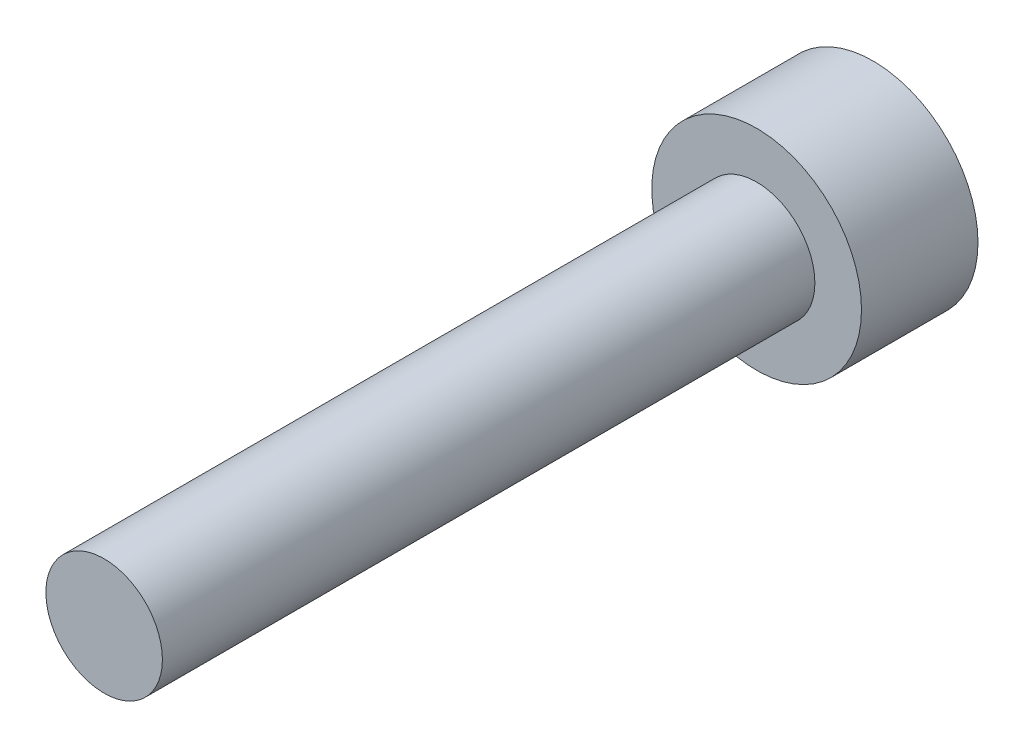
ISO-10303-21;
HEADER;
FILE_DESCRIPTION(('STEP AP214'),'2;1');
FILE_NAME('part.step','',(''),(''),'','','');
FILE_SCHEMA(('AUTOMOTIVE_DESIGN { 1 0 10303 214 1 1 1 1 }'));
ENDSEC;
DATA;
#1=APPLICATION_CONTEXT('core data for automotive mechanical design processes');
#2=APPLICATION_PROTOCOL_DEFINITION('international standard','automotive_design',2000,#1);
#3=PRODUCT_CONTEXT('',#1,'mechanical');
#4=PRODUCT('Part','Part','',(#3));
#5=PRODUCT_RELATED_PRODUCT_CATEGORY('part','',(#4));
#6=PRODUCT_DEFINITION_FORMATION('','',#4);
#7=PRODUCT_DEFINITION_CONTEXT('part definition',#1,'design');
#8=PRODUCT_DEFINITION('design','',#6,#7);
#9=PRODUCT_DEFINITION_SHAPE('','',#8);
#10=(LENGTH_UNIT() NAMED_UNIT(*) SI_UNIT(.MILLI.,.METRE.));
#11=(NAMED_UNIT(*) PLANE_ANGLE_UNIT() SI_UNIT($,.RADIAN.));
#12=(NAMED_UNIT(*) SI_UNIT($,.STERADIAN.) SOLID_ANGLE_UNIT());
#13=UNCERTAINTY_MEASURE_WITH_UNIT(LENGTH_MEASURE(1.E-05),#10,'distance_accuracy_value','');
#14=(GEOMETRIC_REPRESENTATION_CONTEXT(3) GLOBAL_UNCERTAINTY_ASSIGNED_CONTEXT((#13)) GLOBAL_UNIT_ASSIGNED_CONTEXT((#10,
#11,#12)) REPRESENTATION_CONTEXT('',''));
#15=CARTESIAN_POINT('',(0.,0.,0.));
#16=DIRECTION('',(0.,0.,1.));
#17=DIRECTION('',(1.,0.,0.));
#18=AXIS2_PLACEMENT_3D('',#15,#16,#17);
#19=CARTESIAN_POINT('',(0.,0.,-2.5));
#20=DIRECTION('',(0.,0.,1.));
#21=DIRECTION('',(1.,0.,0.));
#22=AXIS2_PLACEMENT_3D('',#19,#20,#21);
#23=PLANE('',#22);
#24=CARTESIAN_POINT('',(0.,0.,-2.5));
#25=DIRECTION('',(0.,0.,1.));
#26=DIRECTION('',(1.,0.,0.));
#27=AXIS2_PLACEMENT_3D('',#24,#25,#26);
#28=CIRCLE('',#27,2.25);
#29=CARTESIAN_POINT('',(2.25,0.,-2.5));
#30=VERTEX_POINT('',#29);
#31=EDGE_CURVE('E50',#30,#30,#28,.T.);
#32=ORIENTED_EDGE('',*,*,#31,.F.);
#33=EDGE_LOOP('',(#32));
#34=FACE_BOUND('',#33,.T.);
#35=DIRECTION('',(0.866025403784441,-0.499999999999995,0.));
#36=VECTOR('',#35,1.);
#37=CARTESIAN_POINT('',(-0.999999999999993,-0.577350269189637,-2.5));
#38=LINE('',#37,#36);
#39=CARTESIAN_POINT('',(-0.999999999999993,-0.577350269189637,-2.5));
#40=VERTEX_POINT('',#39);
#41=CARTESIAN_POINT('',(0.,-1.15470053837925,-2.5));
#42=VERTEX_POINT('',#41);
#43=EDGE_CURVE('E61',#40,#42,#38,.T.);
#44=ORIENTED_EDGE('',*,*,#43,.T.);
#45=DIRECTION('',(0.866025403784438,0.500000000000001,0.));
#46=VECTOR('',#45,1.);
#47=CARTESIAN_POINT('',(0.,-1.15470053837925,-2.5));
#48=LINE('',#47,#46);
#49=CARTESIAN_POINT('',(1.,-0.577350269189624,-2.5));
#50=VERTEX_POINT('',#49);
#51=EDGE_CURVE('E138',#42,#50,#48,.T.);
#52=ORIENTED_EDGE('',*,*,#51,.T.);
#53=DIRECTION('',(0.,1.,0.));
#54=VECTOR('',#53,1.);
#55=CARTESIAN_POINT('',(1.,-0.577350269189624,-2.5));
#56=LINE('',#55,#54);
#57=CARTESIAN_POINT('',(0.999999999999998,0.57735026918963,-2.5));
#58=VERTEX_POINT('',#57);
#59=EDGE_CURVE('E141',#50,#58,#56,.T.);
#60=ORIENTED_EDGE('',*,*,#59,.T.);
#61=DIRECTION('',(-0.866025403784442,0.499999999999995,0.));
#62=VECTOR('',#61,1.);
#63=CARTESIAN_POINT('',(0.999999999999998,0.57735026918963,-2.5));
#64=LINE('',#63,#62);
#65=CARTESIAN_POINT('',(0.,1.15470053837925,-2.5));
#66=VERTEX_POINT('',#65);
#67=EDGE_CURVE('E150',#58,#66,#64,.T.);
#68=ORIENTED_EDGE('',*,*,#67,.T.);
#69=DIRECTION('',(-0.866025403784434,-0.500000000000007,0.));
#70=VECTOR('',#69,1.);
#71=CARTESIAN_POINT('',(0.,1.15470053837925,-2.5));
#72=LINE('',#71,#70);
#73=CARTESIAN_POINT('',(-1.00000000000001,0.577350269189617,-2.5));
#74=VERTEX_POINT('',#73);
#75=EDGE_CURVE('E124',#66,#74,#72,.T.);
#76=ORIENTED_EDGE('',*,*,#75,.T.);
#77=DIRECTION('',(0.,-1.,0.));
#78=VECTOR('',#77,1.);
#79=CARTESIAN_POINT('',(-1.00000000000001,0.577350269189617,-2.5));
#80=LINE('',#79,#78);
#81=EDGE_CURVE('E151',#74,#40,#80,.T.);
#82=ORIENTED_EDGE('',*,*,#81,.T.);
#83=EDGE_LOOP('',(#44,#52,#60,#68,#76,#82));
#84=FACE_BOUND('',#83,.T.);
#85=ADVANCED_FACE('F43',(#34,#84),#23,.F.);
#86=CARTESIAN_POINT('',(0.,0.,0.));
#87=DIRECTION('',(0.,0.,-1.));
#88=DIRECTION('',(-1.,0.,0.));
#89=AXIS2_PLACEMENT_3D('',#86,#87,#88);
#90=CYLINDRICAL_SURFACE('',#89,2.25);
#91=CARTESIAN_POINT('',(0.,0.,0.));
#92=DIRECTION('',(0.,0.,1.));
#93=DIRECTION('',(1.,0.,0.));
#94=AXIS2_PLACEMENT_3D('',#91,#92,#93);
#95=CIRCLE('',#94,2.25);
#96=CARTESIAN_POINT('',(2.25,0.,0.));
#97=VERTEX_POINT('',#96);
#98=EDGE_CURVE('E52',#97,#97,#95,.T.);
#99=ORIENTED_EDGE('',*,*,#98,.F.);
#100=EDGE_LOOP('',(#99));
#101=FACE_BOUND('',#100,.T.);
#102=ORIENTED_EDGE('',*,*,#31,.T.);
#103=EDGE_LOOP('',(#102));
#104=FACE_BOUND('',#103,.T.);
#105=ADVANCED_FACE('F44',(#101,#104),#90,.T.);
#106=CARTESIAN_POINT('',(0.,0.,0.));
#107=DIRECTION('',(0.,0.,1.));
#108=DIRECTION('',(1.,0.,0.));
#109=AXIS2_PLACEMENT_3D('',#106,#107,#108);
#110=PLANE('',#109);
#111=CARTESIAN_POINT('',(0.,0.,0.));
#112=DIRECTION('',(0.,0.,1.));
#113=DIRECTION('',(1.,0.,0.));
#114=AXIS2_PLACEMENT_3D('',#111,#112,#113);
#115=CIRCLE('',#114,1.25);
#116=CARTESIAN_POINT('',(1.25,0.,0.));
#117=VERTEX_POINT('',#116);
#118=EDGE_CURVE('E11',#117,#117,#115,.T.);
#119=ORIENTED_EDGE('',*,*,#118,.F.);
#120=EDGE_LOOP('',(#119));
#121=FACE_BOUND('',#120,.T.);
#122=ORIENTED_EDGE('',*,*,#98,.T.);
#123=EDGE_LOOP('',(#122));
#124=FACE_BOUND('',#123,.T.);
#125=ADVANCED_FACE('F211',(#121,#124),#110,.T.);
#126=CARTESIAN_POINT('',(0.,0.,14.));
#127=DIRECTION('',(0.,0.,-1.));
#128=DIRECTION('',(-1.,0.,0.));
#129=AXIS2_PLACEMENT_3D('',#126,#127,#128);
#130=CYLINDRICAL_SURFACE('',#129,1.25);
#131=CARTESIAN_POINT('',(0.,0.,14.));
#132=DIRECTION('',(0.,0.,1.));
#133=DIRECTION('',(1.,0.,0.));
#134=AXIS2_PLACEMENT_3D('',#131,#132,#133);
#135=CIRCLE('',#134,1.25);
#136=CARTESIAN_POINT('',(1.25,0.,14.));
#137=VERTEX_POINT('',#136);
#138=EDGE_CURVE('E169',#137,#137,#135,.T.);
#139=ORIENTED_EDGE('',*,*,#138,.F.);
#140=EDGE_LOOP('',(#139));
#141=FACE_BOUND('',#140,.T.);
#142=ORIENTED_EDGE('',*,*,#118,.T.);
#143=EDGE_LOOP('',(#142));
#144=FACE_BOUND('',#143,.T.);
#145=ADVANCED_FACE('F210',(#141,#144),#130,.T.);
#146=CARTESIAN_POINT('',(0.,0.,14.));
#147=DIRECTION('',(0.,0.,1.));
#148=DIRECTION('',(1.,0.,0.));
#149=AXIS2_PLACEMENT_3D('',#146,#147,#148);
#150=PLANE('',#149);
#151=ORIENTED_EDGE('',*,*,#138,.T.);
#152=EDGE_LOOP('',(#151));
#153=FACE_BOUND('',#152,.T.);
#154=ADVANCED_FACE('F203',(#153),#150,.T.);
#155=CARTESIAN_POINT('',(-0.999999999999993,-0.577350269189637,-1.25));
#156=DIRECTION('',(0.499999999999995,0.866025403784441,0.));
#157=DIRECTION('',(-0.866025403784441,0.499999999999995,0.));
#158=AXIS2_PLACEMENT_3D('',#155,#156,#157);
#159=PLANE('',#158);
#160=ORIENTED_EDGE('',*,*,#43,.F.);
#161=DIRECTION('',(0.,0.,-1.));
#162=VECTOR('',#161,1.);
#163=CARTESIAN_POINT('',(-0.999999999999993,-0.577350269189637,-1.25));
#164=LINE('',#163,#162);
#165=CARTESIAN_POINT('',(-0.999999999999993,-0.577350269189637,-1.25));
#166=VERTEX_POINT('',#165);
#167=EDGE_CURVE('E132',#166,#40,#164,.T.);
#168=ORIENTED_EDGE('',*,*,#167,.F.);
#169=DIRECTION('',(0.866025403784441,-0.499999999999995,0.));
#170=VECTOR('',#169,1.);
#171=CARTESIAN_POINT('',(-0.999999999999993,-0.577350269189637,-1.25));
#172=LINE('',#171,#170);
#173=CARTESIAN_POINT('',(0.,-1.15470053837925,-1.25));
#174=VERTEX_POINT('',#173);
#175=EDGE_CURVE('E154',#166,#174,#172,.T.);
#176=ORIENTED_EDGE('',*,*,#175,.T.);
#177=DIRECTION('',(0.,0.,-1.));
#178=VECTOR('',#177,1.);
#179=CARTESIAN_POINT('',(0.,-1.15470053837925,-1.25));
#180=LINE('',#179,#178);
#181=EDGE_CURVE('E164',#174,#42,#180,.T.);
#182=ORIENTED_EDGE('',*,*,#181,.T.);
#183=EDGE_LOOP('',(#160,#168,#176,#182));
#184=FACE_BOUND('',#183,.T.);
#185=ADVANCED_FACE('F181',(#184),#159,.T.);
#186=CARTESIAN_POINT('',(0.,-1.15470053837925,-1.25));
#187=DIRECTION('',(-0.500000000000001,0.866025403784438,0.));
#188=DIRECTION('',(-0.866025403784438,-0.500000000000001,0.));
#189=AXIS2_PLACEMENT_3D('',#186,#187,#188);
#190=PLANE('',#189);
#191=ORIENTED_EDGE('',*,*,#51,.F.);
#192=ORIENTED_EDGE('',*,*,#181,.F.);
#193=DIRECTION('',(0.866025403784438,0.500000000000001,0.));
#194=VECTOR('',#193,1.);
#195=CARTESIAN_POINT('',(0.,-1.15470053837925,-1.25));
#196=LINE('',#195,#194);
#197=CARTESIAN_POINT('',(1.,-0.577350269189624,-1.25));
#198=VERTEX_POINT('',#197);
#199=EDGE_CURVE('E99',#174,#198,#196,.T.);
#200=ORIENTED_EDGE('',*,*,#199,.T.);
#201=DIRECTION('',(0.,0.,-1.));
#202=VECTOR('',#201,1.);
#203=CARTESIAN_POINT('',(1.,-0.577350269189624,-1.25));
#204=LINE('',#203,#202);
#205=EDGE_CURVE('E165',#198,#50,#204,.T.);
#206=ORIENTED_EDGE('',*,*,#205,.T.);
#207=EDGE_LOOP('',(#191,#192,#200,#206));
#208=FACE_BOUND('',#207,.T.);
#209=ADVANCED_FACE('F193',(#208),#190,.T.);
#210=CARTESIAN_POINT('',(1.,-0.577350269189624,-1.25));
#211=DIRECTION('',(-1.,0.,0.));
#212=DIRECTION('',(0.,-1.,0.));
#213=AXIS2_PLACEMENT_3D('',#210,#211,#212);
#214=PLANE('',#213);
#215=ORIENTED_EDGE('',*,*,#59,.F.);
#216=ORIENTED_EDGE('',*,*,#205,.F.);
#217=DIRECTION('',(0.,1.,0.));
#218=VECTOR('',#217,1.);
#219=CARTESIAN_POINT('',(1.,-0.577350269189624,-1.25));
#220=LINE('',#219,#218);
#221=CARTESIAN_POINT('',(0.999999999999998,0.57735026918963,-1.25));
#222=VERTEX_POINT('',#221);
#223=EDGE_CURVE('E118',#198,#222,#220,.T.);
#224=ORIENTED_EDGE('',*,*,#223,.T.);
#225=DIRECTION('',(0.,0.,-1.));
#226=VECTOR('',#225,1.);
#227=CARTESIAN_POINT('',(0.999999999999998,0.57735026918963,-1.25));
#228=LINE('',#227,#226);
#229=EDGE_CURVE('E113',#222,#58,#228,.T.);
#230=ORIENTED_EDGE('',*,*,#229,.T.);
#231=EDGE_LOOP('',(#215,#216,#224,#230));
#232=FACE_BOUND('',#231,.T.);
#233=ADVANCED_FACE('F192',(#232),#214,.T.);
#234=CARTESIAN_POINT('',(0.999999999999998,0.57735026918963,-1.25));
#235=DIRECTION('',(-0.499999999999995,-0.866025403784442,0.));
#236=DIRECTION('',(0.866025403784442,-0.499999999999995,0.));
#237=AXIS2_PLACEMENT_3D('',#234,#235,#236);
#238=PLANE('',#237);
#239=ORIENTED_EDGE('',*,*,#67,.F.);
#240=ORIENTED_EDGE('',*,*,#229,.F.);
#241=DIRECTION('',(-0.866025403784442,0.499999999999995,0.));
#242=VECTOR('',#241,1.);
#243=CARTESIAN_POINT('',(0.999999999999998,0.57735026918963,-1.25));
#244=LINE('',#243,#242);
#245=CARTESIAN_POINT('',(0.,1.15470053837925,-1.25));
#246=VERTEX_POINT('',#245);
#247=EDGE_CURVE('E109',#222,#246,#244,.T.);
#248=ORIENTED_EDGE('',*,*,#247,.T.);
#249=DIRECTION('',(0.,0.,-1.));
#250=VECTOR('',#249,1.);
#251=CARTESIAN_POINT('',(0.,1.15470053837925,-1.25));
#252=LINE('',#251,#250);
#253=EDGE_CURVE('E111',#246,#66,#252,.T.);
#254=ORIENTED_EDGE('',*,*,#253,.T.);
#255=EDGE_LOOP('',(#239,#240,#248,#254));
#256=FACE_BOUND('',#255,.T.);
#257=ADVANCED_FACE('F114',(#256),#238,.T.);
#258=CARTESIAN_POINT('',(0.,1.15470053837925,-1.25));
#259=DIRECTION('',(0.500000000000007,-0.866025403784435,0.));
#260=DIRECTION('',(0.866025403784435,0.500000000000007,0.));
#261=AXIS2_PLACEMENT_3D('',#258,#259,#260);
#262=PLANE('',#261);
#263=ORIENTED_EDGE('',*,*,#75,.F.);
#264=ORIENTED_EDGE('',*,*,#253,.F.);
#265=DIRECTION('',(-0.866025403784434,-0.500000000000007,0.));
#266=VECTOR('',#265,1.);
#267=CARTESIAN_POINT('',(0.,1.15470053837925,-1.25));
#268=LINE('',#267,#266);
#269=CARTESIAN_POINT('',(-1.00000000000001,0.577350269189617,-1.25));
#270=VERTEX_POINT('',#269);
#271=EDGE_CURVE('E117',#246,#270,#268,.T.);
#272=ORIENTED_EDGE('',*,*,#271,.T.);
#273=DIRECTION('',(0.,0.,-1.));
#274=VECTOR('',#273,1.);
#275=CARTESIAN_POINT('',(-1.00000000000001,0.577350269189617,-1.25));
#276=LINE('',#275,#274);
#277=EDGE_CURVE('E93',#270,#74,#276,.T.);
#278=ORIENTED_EDGE('',*,*,#277,.T.);
#279=EDGE_LOOP('',(#263,#264,#272,#278));
#280=FACE_BOUND('',#279,.T.);
#281=ADVANCED_FACE('F121',(#280),#262,.T.);
#282=CARTESIAN_POINT('',(-1.00000000000001,0.577350269189617,-1.25));
#283=DIRECTION('',(1.,0.,0.));
#284=DIRECTION('',(0.,1.,0.));
#285=AXIS2_PLACEMENT_3D('',#282,#283,#284);
#286=PLANE('',#285);
#287=ORIENTED_EDGE('',*,*,#81,.F.);
#288=ORIENTED_EDGE('',*,*,#277,.F.);
#289=DIRECTION('',(0.,-1.,0.));
#290=VECTOR('',#289,1.);
#291=CARTESIAN_POINT('',(-1.00000000000001,0.577350269189617,-1.25));
#292=LINE('',#291,#290);
#293=EDGE_CURVE('E68',#270,#166,#292,.T.);
#294=ORIENTED_EDGE('',*,*,#293,.T.);
#295=ORIENTED_EDGE('',*,*,#167,.T.);
#296=EDGE_LOOP('',(#287,#288,#294,#295));
#297=FACE_BOUND('',#296,.T.);
#298=ADVANCED_FACE('F185',(#297),#286,.T.);
#299=CARTESIAN_POINT('',(0.,0.,-1.25));
#300=DIRECTION('',(0.,0.,1.));
#301=DIRECTION('',(1.,0.,0.));
#302=AXIS2_PLACEMENT_3D('',#299,#300,#301);
#303=PLANE('',#302);
#304=ORIENTED_EDGE('',*,*,#175,.F.);
#305=ORIENTED_EDGE('',*,*,#293,.F.);
#306=ORIENTED_EDGE('',*,*,#271,.F.);
#307=ORIENTED_EDGE('',*,*,#247,.F.);
#308=ORIENTED_EDGE('',*,*,#223,.F.);
#309=ORIENTED_EDGE('',*,*,#199,.F.);
#310=EDGE_LOOP('',(#304,#305,#306,#307,#308,#309));
#311=FACE_BOUND('',#310,.T.);
#312=ADVANCED_FACE('F130',(#311),#303,.F.);
#313=CLOSED_SHELL('',(#85,#105,#125,#145,#154,#185,#209,#233,#257,#281,#298,#312));
#314=MANIFOLD_SOLID_BREP('B2',#313);
#315=ADVANCED_BREP_SHAPE_REPRESENTATION('',(#18,#314),#14);
#316=SHAPE_DEFINITION_REPRESENTATION(#9,#315);
ENDSEC;
END-ISO-10303-21;
